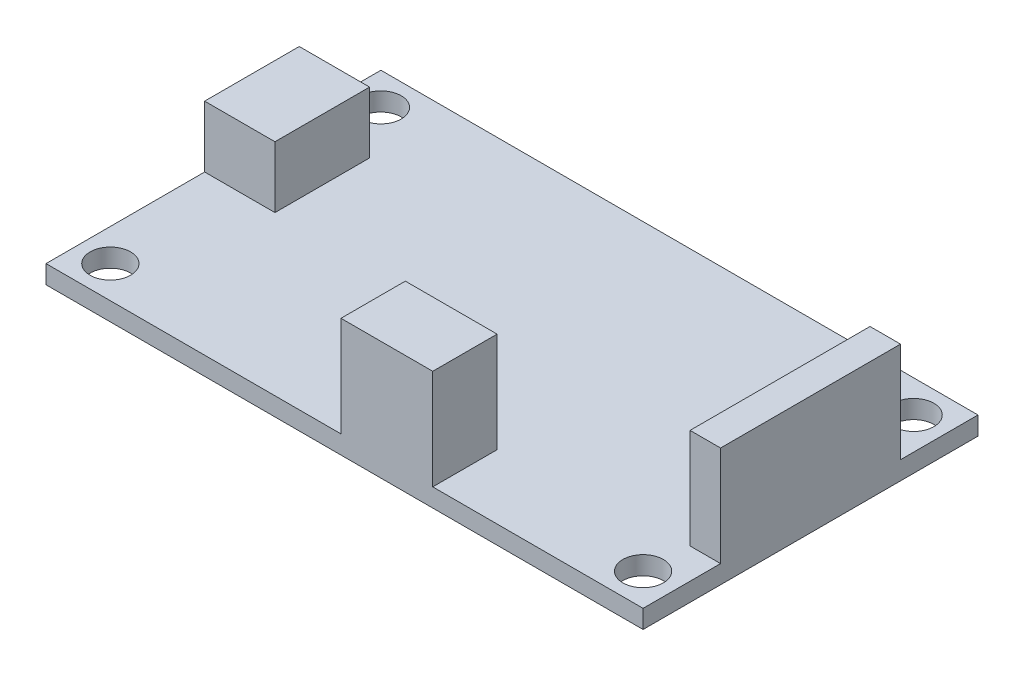
ISO-10303-21;
HEADER;
FILE_DESCRIPTION(('STEP AP214'),'2;1');
FILE_NAME('part.step','',(''),(''),'','','');
FILE_SCHEMA(('AUTOMOTIVE_DESIGN { 1 0 10303 214 1 1 1 1 }'));
ENDSEC;
DATA;
#1=APPLICATION_CONTEXT('core data for automotive mechanical design processes');
#2=APPLICATION_PROTOCOL_DEFINITION('international standard','automotive_design',2000,#1);
#3=PRODUCT_CONTEXT('',#1,'mechanical');
#4=PRODUCT('Part','Part','',(#3));
#5=PRODUCT_RELATED_PRODUCT_CATEGORY('part','',(#4));
#6=PRODUCT_DEFINITION_FORMATION('','',#4);
#7=PRODUCT_DEFINITION_CONTEXT('part definition',#1,'design');
#8=PRODUCT_DEFINITION('design','',#6,#7);
#9=PRODUCT_DEFINITION_SHAPE('','',#8);
#10=(LENGTH_UNIT() NAMED_UNIT(*) SI_UNIT(.MILLI.,.METRE.));
#11=(NAMED_UNIT(*) PLANE_ANGLE_UNIT() SI_UNIT($,.RADIAN.));
#12=(NAMED_UNIT(*) SI_UNIT($,.STERADIAN.) SOLID_ANGLE_UNIT());
#13=UNCERTAINTY_MEASURE_WITH_UNIT(LENGTH_MEASURE(1.E-05),#10,'distance_accuracy_value','');
#14=(GEOMETRIC_REPRESENTATION_CONTEXT(3) GLOBAL_UNCERTAINTY_ASSIGNED_CONTEXT((#13)) GLOBAL_UNIT_ASSIGNED_CONTEXT((#10,
#11,#12)) REPRESENTATION_CONTEXT('',''));
#15=CARTESIAN_POINT('',(0.,0.,0.));
#16=DIRECTION('',(0.,0.,1.));
#17=DIRECTION('',(1.,0.,0.));
#18=AXIS2_PLACEMENT_3D('',#15,#16,#17);
#19=CARTESIAN_POINT('',(-99.1226641897836,1.54,-1.82162319211076));
#20=DIRECTION('',(0.,1.,0.));
#21=DIRECTION('',(0.,0.,1.));
#22=AXIS2_PLACEMENT_3D('',#19,#20,#21);
#23=PLANE('',#22);
#24=CARTESIAN_POINT('',(-51.7226641897835,1.54,-4.52162319211078));
#25=DIRECTION('',(0.,1.,0.));
#26=DIRECTION('',(0.,0.,1.));
#27=AXIS2_PLACEMENT_3D('',#24,#25,#26);
#28=CIRCLE('',#27,1.7);
#29=CARTESIAN_POINT('',(-51.7226641897835,1.54,-2.82162319211078));
#30=VERTEX_POINT('',#29);
#31=EDGE_CURVE('E251',#30,#30,#28,.T.);
#32=ORIENTED_EDGE('',*,*,#31,.F.);
#33=EDGE_LOOP('',(#32));
#34=FACE_BOUND('',#33,.T.);
#35=CARTESIAN_POINT('',(-96.4226641897836,1.54,-27.2216231921108));
#36=DIRECTION('',(0.,1.,0.));
#37=DIRECTION('',(0.,0.,1.));
#38=AXIS2_PLACEMENT_3D('',#35,#36,#37);
#39=CIRCLE('',#38,1.7);
#40=CARTESIAN_POINT('',(-96.4226641897836,1.54,-25.5216231921108));
#41=VERTEX_POINT('',#40);
#42=EDGE_CURVE('E263',#41,#41,#39,.T.);
#43=ORIENTED_EDGE('',*,*,#42,.F.);
#44=EDGE_LOOP('',(#43));
#45=FACE_BOUND('',#44,.T.);
#46=CARTESIAN_POINT('',(-51.7226641897835,1.54,-27.2216231921107));
#47=DIRECTION('',(0.,1.,0.));
#48=DIRECTION('',(0.,0.,-1.));
#49=AXIS2_PLACEMENT_3D('',#46,#47,#48);
#50=CIRCLE('',#49,1.7);
#51=CARTESIAN_POINT('',(-51.7226641897835,1.54,-28.9216231921107));
#52=VERTEX_POINT('',#51);
#53=EDGE_CURVE('E257',#52,#52,#50,.T.);
#54=ORIENTED_EDGE('',*,*,#53,.F.);
#55=EDGE_LOOP('',(#54));
#56=FACE_BOUND('',#55,.T.);
#57=CARTESIAN_POINT('',(-96.4226641897836,1.54,-4.52162319211076));
#58=DIRECTION('',(0.,1.,0.));
#59=DIRECTION('',(0.,0.,-1.));
#60=AXIS2_PLACEMENT_3D('',#57,#58,#59);
#61=CIRCLE('',#60,1.7);
#62=CARTESIAN_POINT('',(-96.4226641897836,1.54,-6.22162319211075));
#63=VERTEX_POINT('',#62);
#64=EDGE_CURVE('E245',#63,#63,#61,.T.);
#65=ORIENTED_EDGE('',*,*,#64,.F.);
#66=EDGE_LOOP('',(#65));
#67=FACE_BOUND('',#66,.T.);
#68=DIRECTION('',(0.,0.,-1.));
#69=VECTOR('',#68,1.);
#70=CARTESIAN_POINT('',(-93.2226641897835,1.54,-23.0716231921108));
#71=LINE('',#70,#69);
#72=CARTESIAN_POINT('',(-93.2226641897835,1.54,-15.1316231921108));
#73=VERTEX_POINT('',#72);
#74=CARTESIAN_POINT('',(-93.2226641897835,1.54,-23.0716231921108));
#75=VERTEX_POINT('',#74);
#76=EDGE_CURVE('E48',#73,#75,#71,.T.);
#77=ORIENTED_EDGE('',*,*,#76,.F.);
#78=DIRECTION('',(1.,0.,0.));
#79=VECTOR('',#78,1.);
#80=CARTESIAN_POINT('',(-99.1226641897835,1.54,-15.1316231921108));
#81=LINE('',#80,#79);
#82=CARTESIAN_POINT('',(-99.1226641897835,1.54,-15.1316231921108));
#83=VERTEX_POINT('',#82);
#84=EDGE_CURVE('E543',#83,#73,#81,.T.);
#85=ORIENTED_EDGE('',*,*,#84,.F.);
#86=DIRECTION('',(0.,0.,1.));
#87=VECTOR('',#86,1.);
#88=CARTESIAN_POINT('',(-99.1226641897835,1.54,-29.9216231921108));
#89=LINE('',#88,#87);
#90=CARTESIAN_POINT('',(-99.1226641897836,1.54,-1.82162319211076));
#91=VERTEX_POINT('',#90);
#92=EDGE_CURVE('E167',#83,#91,#89,.T.);
#93=ORIENTED_EDGE('',*,*,#92,.T.);
#94=DIRECTION('',(1.,0.,0.));
#95=VECTOR('',#94,1.);
#96=CARTESIAN_POINT('',(-99.1226641897836,1.54,-1.82162319211076));
#97=LINE('',#96,#95);
#98=CARTESIAN_POINT('',(-74.3726641897835,1.54,-1.82162319211076));
#99=VERTEX_POINT('',#98);
#100=EDGE_CURVE('E272',#91,#99,#97,.T.);
#101=ORIENTED_EDGE('',*,*,#100,.T.);
#102=DIRECTION('',(0.,0.,1.));
#103=VECTOR('',#102,1.);
#104=CARTESIAN_POINT('',(-74.3726641897835,1.54,-1.82162319211076));
#105=LINE('',#104,#103);
#106=CARTESIAN_POINT('',(-74.3726641897835,1.54,-7.22162319211076));
#107=VERTEX_POINT('',#106);
#108=EDGE_CURVE('E181',#107,#99,#105,.T.);
#109=ORIENTED_EDGE('',*,*,#108,.F.);
#110=DIRECTION('',(-1.,0.,0.));
#111=VECTOR('',#110,1.);
#112=CARTESIAN_POINT('',(-66.6726641897835,1.54,-7.22162319211076));
#113=LINE('',#112,#111);
#114=CARTESIAN_POINT('',(-66.6726641897835,1.54,-7.22162319211076));
#115=VERTEX_POINT('',#114);
#116=EDGE_CURVE('E171',#115,#107,#113,.T.);
#117=ORIENTED_EDGE('',*,*,#116,.F.);
#118=DIRECTION('',(0.,0.,-1.));
#119=VECTOR('',#118,1.);
#120=CARTESIAN_POINT('',(-66.6726641897835,1.54,-1.82162319211076));
#121=LINE('',#120,#119);
#122=CARTESIAN_POINT('',(-66.6726641897835,1.54,-1.82162319211076));
#123=VERTEX_POINT('',#122);
#124=EDGE_CURVE('E168',#123,#115,#121,.T.);
#125=ORIENTED_EDGE('',*,*,#124,.F.);
#126=CARTESIAN_POINT('',(-49.0226641897835,1.54,-1.82162319211076));
#127=VERTEX_POINT('',#126);
#128=EDGE_CURVE('E271',#123,#127,#97,.T.);
#129=ORIENTED_EDGE('',*,*,#128,.T.);
#130=DIRECTION('',(0.,0.,-1.));
#131=VECTOR('',#130,1.);
#132=CARTESIAN_POINT('',(-49.0226641897835,1.54,-29.9216231921108));
#133=LINE('',#132,#131);
#134=CARTESIAN_POINT('',(-49.0226641897835,1.54,-8.32162319211076));
#135=VERTEX_POINT('',#134);
#136=EDGE_CURVE('E283',#127,#135,#133,.T.);
#137=ORIENTED_EDGE('',*,*,#136,.T.);
#138=DIRECTION('',(1.,0.,0.));
#139=VECTOR('',#138,1.);
#140=CARTESIAN_POINT('',(-49.0226641897835,1.54,-8.32162319211076));
#141=LINE('',#140,#139);
#142=CARTESIAN_POINT('',(-51.5826641897835,1.54,-8.32162319211076));
#143=VERTEX_POINT('',#142);
#144=EDGE_CURVE('E208',#143,#135,#141,.T.);
#145=ORIENTED_EDGE('',*,*,#144,.F.);
#146=DIRECTION('',(0.,0.,1.));
#147=VECTOR('',#146,1.);
#148=CARTESIAN_POINT('',(-51.5826641897835,1.54,-23.4216231921108));
#149=LINE('',#148,#147);
#150=CARTESIAN_POINT('',(-51.5826641897835,1.54,-23.4216231921108));
#151=VERTEX_POINT('',#150);
#152=EDGE_CURVE('E215',#151,#143,#149,.T.);
#153=ORIENTED_EDGE('',*,*,#152,.F.);
#154=DIRECTION('',(-1.,0.,0.));
#155=VECTOR('',#154,1.);
#156=CARTESIAN_POINT('',(-49.0226641897835,1.54,-23.4216231921108));
#157=LINE('',#156,#155);
#158=CARTESIAN_POINT('',(-49.0226641897835,1.54,-23.4216231921108));
#159=VERTEX_POINT('',#158);
#160=EDGE_CURVE('E203',#159,#151,#157,.T.);
#161=ORIENTED_EDGE('',*,*,#160,.F.);
#162=CARTESIAN_POINT('',(-49.0226641897835,1.54,-29.9216231921108));
#163=VERTEX_POINT('',#162);
#164=EDGE_CURVE('E274',#159,#163,#133,.T.);
#165=ORIENTED_EDGE('',*,*,#164,.T.);
#166=DIRECTION('',(-1.,0.,0.));
#167=VECTOR('',#166,1.);
#168=CARTESIAN_POINT('',(-99.1226641897835,1.54,-29.9216231921108));
#169=LINE('',#168,#167);
#170=CARTESIAN_POINT('',(-99.1226641897835,1.54,-29.9216231921108));
#171=VERTEX_POINT('',#170);
#172=EDGE_CURVE('E277',#163,#171,#169,.T.);
#173=ORIENTED_EDGE('',*,*,#172,.T.);
#174=CARTESIAN_POINT('',(-99.1226641897835,1.54,-23.0716231921108));
#175=VERTEX_POINT('',#174);
#176=EDGE_CURVE('E269',#171,#175,#89,.T.);
#177=ORIENTED_EDGE('',*,*,#176,.T.);
#178=DIRECTION('',(-1.,0.,0.));
#179=VECTOR('',#178,1.);
#180=CARTESIAN_POINT('',(-99.1226641897835,1.54,-23.0716231921108));
#181=LINE('',#180,#179);
#182=EDGE_CURVE('E53',#75,#175,#181,.T.);
#183=ORIENTED_EDGE('',*,*,#182,.F.);
#184=EDGE_LOOP('',(#77,#85,#93,#101,#109,#117,#125,#129,#137,#145,#153,#161,#165,#173,#177,#183));
#185=FACE_BOUND('',#184,.T.);
#186=ADVANCED_FACE('F31',(#34,#45,#56,#67,#185),#23,.T.);
#187=CARTESIAN_POINT('',(-99.1226641897836,0.,-1.82162319211076));
#188=DIRECTION('',(0.,1.,0.));
#189=DIRECTION('',(0.,0.,1.));
#190=AXIS2_PLACEMENT_3D('',#187,#188,#189);
#191=PLANE('',#190);
#192=CARTESIAN_POINT('',(-51.7226641897835,0.,-4.52162319211078));
#193=DIRECTION('',(0.,1.,0.));
#194=DIRECTION('',(0.,0.,1.));
#195=AXIS2_PLACEMENT_3D('',#192,#193,#194);
#196=CIRCLE('',#195,1.7);
#197=CARTESIAN_POINT('',(-51.7226641897835,0.,-2.82162319211078));
#198=VERTEX_POINT('',#197);
#199=EDGE_CURVE('E248',#198,#198,#196,.T.);
#200=ORIENTED_EDGE('',*,*,#199,.T.);
#201=EDGE_LOOP('',(#200));
#202=FACE_BOUND('',#201,.T.);
#203=CARTESIAN_POINT('',(-96.4226641897836,0.,-27.2216231921108));
#204=DIRECTION('',(0.,1.,0.));
#205=DIRECTION('',(0.,0.,1.));
#206=AXIS2_PLACEMENT_3D('',#203,#204,#205);
#207=CIRCLE('',#206,1.7);
#208=CARTESIAN_POINT('',(-96.4226641897836,0.,-25.5216231921108));
#209=VERTEX_POINT('',#208);
#210=EDGE_CURVE('E260',#209,#209,#207,.T.);
#211=ORIENTED_EDGE('',*,*,#210,.T.);
#212=EDGE_LOOP('',(#211));
#213=FACE_BOUND('',#212,.T.);
#214=DIRECTION('',(0.,0.,1.));
#215=VECTOR('',#214,1.);
#216=CARTESIAN_POINT('',(-99.1226641897835,0.,-29.9216231921108));
#217=LINE('',#216,#215);
#218=CARTESIAN_POINT('',(-99.1226641897835,0.,-29.9216231921108));
#219=VERTEX_POINT('',#218);
#220=CARTESIAN_POINT('',(-99.1226641897836,0.,-1.82162319211076));
#221=VERTEX_POINT('',#220);
#222=EDGE_CURVE('E266',#219,#221,#217,.T.);
#223=ORIENTED_EDGE('',*,*,#222,.F.);
#224=DIRECTION('',(-1.,0.,0.));
#225=VECTOR('',#224,1.);
#226=CARTESIAN_POINT('',(-99.1226641897835,0.,-29.9216231921108));
#227=LINE('',#226,#225);
#228=CARTESIAN_POINT('',(-49.0226641897835,0.,-29.9216231921108));
#229=VERTEX_POINT('',#228);
#230=EDGE_CURVE('E293',#229,#219,#227,.T.);
#231=ORIENTED_EDGE('',*,*,#230,.F.);
#232=DIRECTION('',(0.,0.,-1.));
#233=VECTOR('',#232,1.);
#234=CARTESIAN_POINT('',(-49.0226641897835,0.,-29.9216231921108));
#235=LINE('',#234,#233);
#236=CARTESIAN_POINT('',(-49.0226641897835,0.,-1.82162319211076));
#237=VERTEX_POINT('',#236);
#238=EDGE_CURVE('E295',#237,#229,#235,.T.);
#239=ORIENTED_EDGE('',*,*,#238,.F.);
#240=DIRECTION('',(1.,0.,0.));
#241=VECTOR('',#240,1.);
#242=CARTESIAN_POINT('',(-99.1226641897836,0.,-1.82162319211076));
#243=LINE('',#242,#241);
#244=EDGE_CURVE('E297',#221,#237,#243,.T.);
#245=ORIENTED_EDGE('',*,*,#244,.F.);
#246=EDGE_LOOP('',(#223,#231,#239,#245));
#247=FACE_BOUND('',#246,.T.);
#248=CARTESIAN_POINT('',(-51.7226641897835,0.,-27.2216231921107));
#249=DIRECTION('',(0.,1.,0.));
#250=DIRECTION('',(0.,0.,-1.));
#251=AXIS2_PLACEMENT_3D('',#248,#249,#250);
#252=CIRCLE('',#251,1.7);
#253=CARTESIAN_POINT('',(-51.7226641897835,0.,-28.9216231921107));
#254=VERTEX_POINT('',#253);
#255=EDGE_CURVE('E254',#254,#254,#252,.T.);
#256=ORIENTED_EDGE('',*,*,#255,.T.);
#257=EDGE_LOOP('',(#256));
#258=FACE_BOUND('',#257,.T.);
#259=CARTESIAN_POINT('',(-96.4226641897836,0.,-4.52162319211076));
#260=DIRECTION('',(0.,1.,0.));
#261=DIRECTION('',(0.,0.,-1.));
#262=AXIS2_PLACEMENT_3D('',#259,#260,#261);
#263=CIRCLE('',#262,1.7);
#264=CARTESIAN_POINT('',(-96.4226641897836,0.,-6.22162319211075));
#265=VERTEX_POINT('',#264);
#266=EDGE_CURVE('E243',#265,#265,#263,.T.);
#267=ORIENTED_EDGE('',*,*,#266,.T.);
#268=EDGE_LOOP('',(#267));
#269=FACE_BOUND('',#268,.T.);
#270=ADVANCED_FACE('F303',(#202,#213,#247,#258,#269),#191,.F.);
#271=CARTESIAN_POINT('',(-99.1226641897835,1.54,-29.9216231921108));
#272=DIRECTION('',(1.,0.,0.));
#273=DIRECTION('',(0.,0.,-1.));
#274=AXIS2_PLACEMENT_3D('',#271,#272,#273);
#275=PLANE('',#274);
#276=ORIENTED_EDGE('',*,*,#222,.T.);
#277=DIRECTION('',(0.,-1.,0.));
#278=VECTOR('',#277,1.);
#279=CARTESIAN_POINT('',(-99.1226641897836,1.54,-1.82162319211076));
#280=LINE('',#279,#278);
#281=EDGE_CURVE('E11',#91,#221,#280,.T.);
#282=ORIENTED_EDGE('',*,*,#281,.F.);
#283=ORIENTED_EDGE('',*,*,#92,.F.);
#284=DIRECTION('',(0.,-1.,0.));
#285=VECTOR('',#284,1.);
#286=CARTESIAN_POINT('',(-99.1226641897835,6.69,-15.1316231921108));
#287=LINE('',#286,#285);
#288=CARTESIAN_POINT('',(-99.1226641897835,6.69,-15.1316231921108));
#289=VERTEX_POINT('',#288);
#290=EDGE_CURVE('E149',#289,#83,#287,.T.);
#291=ORIENTED_EDGE('',*,*,#290,.F.);
#292=DIRECTION('',(0.,0.,1.));
#293=VECTOR('',#292,1.);
#294=CARTESIAN_POINT('',(-99.1226641897835,6.69,-23.0716231921108));
#295=LINE('',#294,#293);
#296=CARTESIAN_POINT('',(-99.1226641897835,6.69,-23.0716231921108));
#297=VERTEX_POINT('',#296);
#298=EDGE_CURVE('E155',#297,#289,#295,.T.);
#299=ORIENTED_EDGE('',*,*,#298,.F.);
#300=DIRECTION('',(0.,-1.,0.));
#301=VECTOR('',#300,1.);
#302=CARTESIAN_POINT('',(-99.1226641897835,6.69,-23.0716231921108));
#303=LINE('',#302,#301);
#304=EDGE_CURVE('E536',#297,#175,#303,.T.);
#305=ORIENTED_EDGE('',*,*,#304,.T.);
#306=ORIENTED_EDGE('',*,*,#176,.F.);
#307=DIRECTION('',(0.,-1.,0.));
#308=VECTOR('',#307,1.);
#309=CARTESIAN_POINT('',(-99.1226641897835,1.54,-29.9216231921108));
#310=LINE('',#309,#308);
#311=EDGE_CURVE('E290',#171,#219,#310,.T.);
#312=ORIENTED_EDGE('',*,*,#311,.T.);
#313=EDGE_LOOP('',(#276,#282,#283,#291,#299,#305,#306,#312));
#314=FACE_BOUND('',#313,.T.);
#315=ADVANCED_FACE('F33',(#314),#275,.F.);
#316=CARTESIAN_POINT('',(-99.1226641897836,1.54,-1.82162319211076));
#317=DIRECTION('',(0.,0.,-1.));
#318=DIRECTION('',(-1.,0.,0.));
#319=AXIS2_PLACEMENT_3D('',#316,#317,#318);
#320=PLANE('',#319);
#321=ORIENTED_EDGE('',*,*,#244,.T.);
#322=DIRECTION('',(0.,-1.,0.));
#323=VECTOR('',#322,1.);
#324=CARTESIAN_POINT('',(-49.0226641897835,1.54,-1.82162319211076));
#325=LINE('',#324,#323);
#326=EDGE_CURVE('E40',#127,#237,#325,.T.);
#327=ORIENTED_EDGE('',*,*,#326,.F.);
#328=ORIENTED_EDGE('',*,*,#128,.F.);
#329=DIRECTION('',(0.,-1.,0.));
#330=VECTOR('',#329,1.);
#331=CARTESIAN_POINT('',(-66.6726641897835,9.94,-1.82162319211076));
#332=LINE('',#331,#330);
#333=CARTESIAN_POINT('',(-66.6726641897835,9.94,-1.82162319211076));
#334=VERTEX_POINT('',#333);
#335=EDGE_CURVE('E186',#334,#123,#332,.T.);
#336=ORIENTED_EDGE('',*,*,#335,.F.);
#337=DIRECTION('',(1.,0.,0.));
#338=VECTOR('',#337,1.);
#339=CARTESIAN_POINT('',(-66.6726641897835,9.94,-1.82162319211076));
#340=LINE('',#339,#338);
#341=CARTESIAN_POINT('',(-74.3726641897835,9.94,-1.82162319211076));
#342=VERTEX_POINT('',#341);
#343=EDGE_CURVE('E185',#342,#334,#340,.T.);
#344=ORIENTED_EDGE('',*,*,#343,.F.);
#345=DIRECTION('',(0.,-1.,0.));
#346=VECTOR('',#345,1.);
#347=CARTESIAN_POINT('',(-74.3726641897835,9.94,-1.82162319211076));
#348=LINE('',#347,#346);
#349=EDGE_CURVE('E194',#342,#99,#348,.T.);
#350=ORIENTED_EDGE('',*,*,#349,.T.);
#351=ORIENTED_EDGE('',*,*,#100,.F.);
#352=ORIENTED_EDGE('',*,*,#281,.T.);
#353=EDGE_LOOP('',(#321,#327,#328,#336,#344,#350,#351,#352));
#354=FACE_BOUND('',#353,.T.);
#355=ADVANCED_FACE('F309',(#354),#320,.F.);
#356=CARTESIAN_POINT('',(-49.0226641897835,1.54,-29.9216231921108));
#357=DIRECTION('',(-1.,0.,0.));
#358=DIRECTION('',(0.,0.,1.));
#359=AXIS2_PLACEMENT_3D('',#356,#357,#358);
#360=PLANE('',#359);
#361=ORIENTED_EDGE('',*,*,#238,.T.);
#362=DIRECTION('',(0.,-1.,0.));
#363=VECTOR('',#362,1.);
#364=CARTESIAN_POINT('',(-49.0226641897835,1.54,-29.9216231921108));
#365=LINE('',#364,#363);
#366=EDGE_CURVE('E287',#163,#229,#365,.T.);
#367=ORIENTED_EDGE('',*,*,#366,.F.);
#368=ORIENTED_EDGE('',*,*,#164,.F.);
#369=DIRECTION('',(0.,-1.,0.));
#370=VECTOR('',#369,1.);
#371=CARTESIAN_POINT('',(-49.0226641897835,9.94,-23.4216231921108));
#372=LINE('',#371,#370);
#373=CARTESIAN_POINT('',(-49.0226641897835,9.94,-23.4216231921108));
#374=VERTEX_POINT('',#373);
#375=EDGE_CURVE('E238',#374,#159,#372,.T.);
#376=ORIENTED_EDGE('',*,*,#375,.F.);
#377=DIRECTION('',(0.,0.,-1.));
#378=VECTOR('',#377,1.);
#379=CARTESIAN_POINT('',(-49.0226641897835,9.94,-23.4216231921108));
#380=LINE('',#379,#378);
#381=CARTESIAN_POINT('',(-49.0226641897835,9.94,-8.32162319211076));
#382=VERTEX_POINT('',#381);
#383=EDGE_CURVE('E204',#382,#374,#380,.T.);
#384=ORIENTED_EDGE('',*,*,#383,.F.);
#385=DIRECTION('',(0.,-1.,0.));
#386=VECTOR('',#385,1.);
#387=CARTESIAN_POINT('',(-49.0226641897835,9.94,-8.32162319211076));
#388=LINE('',#387,#386);
#389=EDGE_CURVE('E214',#382,#135,#388,.T.);
#390=ORIENTED_EDGE('',*,*,#389,.T.);
#391=ORIENTED_EDGE('',*,*,#136,.F.);
#392=ORIENTED_EDGE('',*,*,#326,.T.);
#393=EDGE_LOOP('',(#361,#367,#368,#376,#384,#390,#391,#392));
#394=FACE_BOUND('',#393,.T.);
#395=ADVANCED_FACE('F324',(#394),#360,.F.);
#396=CARTESIAN_POINT('',(-99.1226641897835,1.54,-29.9216231921108));
#397=DIRECTION('',(0.,0.,1.));
#398=DIRECTION('',(1.,0.,0.));
#399=AXIS2_PLACEMENT_3D('',#396,#397,#398);
#400=PLANE('',#399);
#401=ORIENTED_EDGE('',*,*,#230,.T.);
#402=ORIENTED_EDGE('',*,*,#311,.F.);
#403=ORIENTED_EDGE('',*,*,#172,.F.);
#404=ORIENTED_EDGE('',*,*,#366,.T.);
#405=EDGE_LOOP('',(#401,#402,#403,#404));
#406=FACE_BOUND('',#405,.T.);
#407=ADVANCED_FACE('F361',(#406),#400,.F.);
#408=CARTESIAN_POINT('',(-96.4226641897836,1.54,-27.2216231921108));
#409=DIRECTION('',(0.,-1.,0.));
#410=DIRECTION('',(0.,0.,-1.));
#411=AXIS2_PLACEMENT_3D('',#408,#409,#410);
#412=CYLINDRICAL_SURFACE('',#411,1.7);
#413=ORIENTED_EDGE('',*,*,#42,.T.);
#414=EDGE_LOOP('',(#413));
#415=FACE_BOUND('',#414,.T.);
#416=ORIENTED_EDGE('',*,*,#210,.F.);
#417=EDGE_LOOP('',(#416));
#418=FACE_BOUND('',#417,.T.);
#419=ADVANCED_FACE('F358',(#415,#418),#412,.F.);
#420=CARTESIAN_POINT('',(-51.7226641897835,1.54,-27.2216231921107));
#421=DIRECTION('',(0.,-1.,0.));
#422=DIRECTION('',(0.,0.,-1.));
#423=AXIS2_PLACEMENT_3D('',#420,#421,#422);
#424=CYLINDRICAL_SURFACE('',#423,1.7);
#425=ORIENTED_EDGE('',*,*,#53,.T.);
#426=EDGE_LOOP('',(#425));
#427=FACE_BOUND('',#426,.T.);
#428=ORIENTED_EDGE('',*,*,#255,.F.);
#429=EDGE_LOOP('',(#428));
#430=FACE_BOUND('',#429,.T.);
#431=ADVANCED_FACE('F394',(#427,#430),#424,.F.);
#432=CARTESIAN_POINT('',(-51.7226641897835,1.54,-4.52162319211078));
#433=DIRECTION('',(0.,-1.,0.));
#434=DIRECTION('',(0.,0.,-1.));
#435=AXIS2_PLACEMENT_3D('',#432,#433,#434);
#436=CYLINDRICAL_SURFACE('',#435,1.7);
#437=ORIENTED_EDGE('',*,*,#31,.T.);
#438=EDGE_LOOP('',(#437));
#439=FACE_BOUND('',#438,.T.);
#440=ORIENTED_EDGE('',*,*,#199,.F.);
#441=EDGE_LOOP('',(#440));
#442=FACE_BOUND('',#441,.T.);
#443=ADVANCED_FACE('F344',(#439,#442),#436,.F.);
#444=CARTESIAN_POINT('',(-96.4226641897836,1.54,-4.52162319211076));
#445=DIRECTION('',(0.,-1.,0.));
#446=DIRECTION('',(0.,0.,-1.));
#447=AXIS2_PLACEMENT_3D('',#444,#445,#446);
#448=CYLINDRICAL_SURFACE('',#447,1.7);
#449=ORIENTED_EDGE('',*,*,#64,.T.);
#450=EDGE_LOOP('',(#449));
#451=FACE_BOUND('',#450,.T.);
#452=ORIENTED_EDGE('',*,*,#266,.F.);
#453=EDGE_LOOP('',(#452));
#454=FACE_BOUND('',#453,.T.);
#455=ADVANCED_FACE('F337',(#451,#454),#448,.F.);
#456=CARTESIAN_POINT('',(-49.0226641897835,9.94,-23.4216231921108));
#457=DIRECTION('',(0.,0.,1.));
#458=DIRECTION('',(1.,0.,0.));
#459=AXIS2_PLACEMENT_3D('',#456,#457,#458);
#460=PLANE('',#459);
#461=ORIENTED_EDGE('',*,*,#160,.T.);
#462=DIRECTION('',(0.,-1.,0.));
#463=VECTOR('',#462,1.);
#464=CARTESIAN_POINT('',(-51.5826641897835,9.94,-23.4216231921108));
#465=LINE('',#464,#463);
#466=CARTESIAN_POINT('',(-51.5826641897835,9.94,-23.4216231921108));
#467=VERTEX_POINT('',#466);
#468=EDGE_CURVE('E233',#467,#151,#465,.T.);
#469=ORIENTED_EDGE('',*,*,#468,.F.);
#470=DIRECTION('',(-1.,0.,0.));
#471=VECTOR('',#470,1.);
#472=CARTESIAN_POINT('',(-49.0226641897835,9.94,-23.4216231921108));
#473=LINE('',#472,#471);
#474=EDGE_CURVE('E207',#374,#467,#473,.T.);
#475=ORIENTED_EDGE('',*,*,#474,.F.);
#476=ORIENTED_EDGE('',*,*,#375,.T.);
#477=EDGE_LOOP('',(#461,#469,#475,#476));
#478=FACE_BOUND('',#477,.T.);
#479=ADVANCED_FACE('F333',(#478),#460,.F.);
#480=CARTESIAN_POINT('',(-51.5826641897835,9.94,-23.4216231921108));
#481=DIRECTION('',(1.,0.,0.));
#482=DIRECTION('',(0.,0.,-1.));
#483=AXIS2_PLACEMENT_3D('',#480,#481,#482);
#484=PLANE('',#483);
#485=ORIENTED_EDGE('',*,*,#152,.T.);
#486=DIRECTION('',(0.,-1.,0.));
#487=VECTOR('',#486,1.);
#488=CARTESIAN_POINT('',(-51.5826641897835,9.94,-8.32162319211076));
#489=LINE('',#488,#487);
#490=CARTESIAN_POINT('',(-51.5826641897835,9.94,-8.32162319211076));
#491=VERTEX_POINT('',#490);
#492=EDGE_CURVE('E220',#491,#143,#489,.T.);
#493=ORIENTED_EDGE('',*,*,#492,.F.);
#494=DIRECTION('',(0.,0.,1.));
#495=VECTOR('',#494,1.);
#496=CARTESIAN_POINT('',(-51.5826641897835,9.94,-23.4216231921108));
#497=LINE('',#496,#495);
#498=EDGE_CURVE('E210',#467,#491,#497,.T.);
#499=ORIENTED_EDGE('',*,*,#498,.F.);
#500=ORIENTED_EDGE('',*,*,#468,.T.);
#501=EDGE_LOOP('',(#485,#493,#499,#500));
#502=FACE_BOUND('',#501,.T.);
#503=ADVANCED_FACE('F330',(#502),#484,.F.);
#504=CARTESIAN_POINT('',(-49.0226641897835,9.94,-8.32162319211076));
#505=DIRECTION('',(0.,0.,-1.));
#506=DIRECTION('',(-1.,0.,0.));
#507=AXIS2_PLACEMENT_3D('',#504,#505,#506);
#508=PLANE('',#507);
#509=ORIENTED_EDGE('',*,*,#144,.T.);
#510=ORIENTED_EDGE('',*,*,#389,.F.);
#511=DIRECTION('',(1.,0.,0.));
#512=VECTOR('',#511,1.);
#513=CARTESIAN_POINT('',(-49.0226641897835,9.94,-8.32162319211076));
#514=LINE('',#513,#512);
#515=EDGE_CURVE('E212',#491,#382,#514,.T.);
#516=ORIENTED_EDGE('',*,*,#515,.F.);
#517=ORIENTED_EDGE('',*,*,#492,.T.);
#518=EDGE_LOOP('',(#509,#510,#516,#517));
#519=FACE_BOUND('',#518,.T.);
#520=ADVANCED_FACE('F325',(#519),#508,.F.);
#521=CARTESIAN_POINT('',(-49.0226641897835,9.94,-8.32162319211076));
#522=DIRECTION('',(0.,-1.,0.));
#523=DIRECTION('',(0.,0.,-1.));
#524=AXIS2_PLACEMENT_3D('',#521,#522,#523);
#525=PLANE('',#524);
#526=ORIENTED_EDGE('',*,*,#383,.T.);
#527=ORIENTED_EDGE('',*,*,#474,.T.);
#528=ORIENTED_EDGE('',*,*,#498,.T.);
#529=ORIENTED_EDGE('',*,*,#515,.T.);
#530=EDGE_LOOP('',(#526,#527,#528,#529));
#531=FACE_BOUND('',#530,.T.);
#532=ADVANCED_FACE('F329',(#531),#525,.F.);
#533=CARTESIAN_POINT('',(-66.6726641897835,9.94,-1.82162319211076));
#534=DIRECTION('',(-1.,0.,0.));
#535=DIRECTION('',(0.,0.,1.));
#536=AXIS2_PLACEMENT_3D('',#533,#534,#535);
#537=PLANE('',#536);
#538=ORIENTED_EDGE('',*,*,#124,.T.);
#539=DIRECTION('',(0.,-1.,0.));
#540=VECTOR('',#539,1.);
#541=CARTESIAN_POINT('',(-66.6726641897835,9.94,-7.22162319211076));
#542=LINE('',#541,#540);
#543=CARTESIAN_POINT('',(-66.6726641897835,9.94,-7.22162319211076));
#544=VERTEX_POINT('',#543);
#545=EDGE_CURVE('E200',#544,#115,#542,.T.);
#546=ORIENTED_EDGE('',*,*,#545,.F.);
#547=DIRECTION('',(0.,0.,-1.));
#548=VECTOR('',#547,1.);
#549=CARTESIAN_POINT('',(-66.6726641897835,9.94,-1.82162319211076));
#550=LINE('',#549,#548);
#551=EDGE_CURVE('E177',#334,#544,#550,.T.);
#552=ORIENTED_EDGE('',*,*,#551,.F.);
#553=ORIENTED_EDGE('',*,*,#335,.T.);
#554=EDGE_LOOP('',(#538,#546,#552,#553));
#555=FACE_BOUND('',#554,.T.);
#556=ADVANCED_FACE('F323',(#555),#537,.F.);
#557=CARTESIAN_POINT('',(-66.6726641897835,9.94,-7.22162319211076));
#558=DIRECTION('',(0.,0.,1.));
#559=DIRECTION('',(1.,0.,0.));
#560=AXIS2_PLACEMENT_3D('',#557,#558,#559);
#561=PLANE('',#560);
#562=ORIENTED_EDGE('',*,*,#116,.T.);
#563=DIRECTION('',(0.,-1.,0.));
#564=VECTOR('',#563,1.);
#565=CARTESIAN_POINT('',(-74.3726641897835,9.94,-7.22162319211076));
#566=LINE('',#565,#564);
#567=CARTESIAN_POINT('',(-74.3726641897835,9.94,-7.22162319211076));
#568=VERTEX_POINT('',#567);
#569=EDGE_CURVE('E197',#568,#107,#566,.T.);
#570=ORIENTED_EDGE('',*,*,#569,.F.);
#571=DIRECTION('',(-1.,0.,0.));
#572=VECTOR('',#571,1.);
#573=CARTESIAN_POINT('',(-66.6726641897835,9.94,-7.22162319211076));
#574=LINE('',#573,#572);
#575=EDGE_CURVE('E180',#544,#568,#574,.T.);
#576=ORIENTED_EDGE('',*,*,#575,.F.);
#577=ORIENTED_EDGE('',*,*,#545,.T.);
#578=EDGE_LOOP('',(#562,#570,#576,#577));
#579=FACE_BOUND('',#578,.T.);
#580=ADVANCED_FACE('F317',(#579),#561,.F.);
#581=CARTESIAN_POINT('',(-74.3726641897835,9.94,-1.82162319211076));
#582=DIRECTION('',(1.,0.,0.));
#583=DIRECTION('',(0.,0.,-1.));
#584=AXIS2_PLACEMENT_3D('',#581,#582,#583);
#585=PLANE('',#584);
#586=ORIENTED_EDGE('',*,*,#108,.T.);
#587=ORIENTED_EDGE('',*,*,#349,.F.);
#588=DIRECTION('',(0.,0.,1.));
#589=VECTOR('',#588,1.);
#590=CARTESIAN_POINT('',(-74.3726641897835,9.94,-1.82162319211076));
#591=LINE('',#590,#589);
#592=EDGE_CURVE('E183',#568,#342,#591,.T.);
#593=ORIENTED_EDGE('',*,*,#592,.F.);
#594=ORIENTED_EDGE('',*,*,#569,.T.);
#595=EDGE_LOOP('',(#586,#587,#593,#594));
#596=FACE_BOUND('',#595,.T.);
#597=ADVANCED_FACE('F313',(#596),#585,.F.);
#598=CARTESIAN_POINT('',(-66.6726641897835,9.94,-7.22162319211076));
#599=DIRECTION('',(0.,1.,0.));
#600=DIRECTION('',(0.,0.,1.));
#601=AXIS2_PLACEMENT_3D('',#598,#599,#600);
#602=PLANE('',#601);
#603=ORIENTED_EDGE('',*,*,#551,.T.);
#604=ORIENTED_EDGE('',*,*,#575,.T.);
#605=ORIENTED_EDGE('',*,*,#592,.T.);
#606=ORIENTED_EDGE('',*,*,#343,.T.);
#607=EDGE_LOOP('',(#603,#604,#605,#606));
#608=FACE_BOUND('',#607,.T.);
#609=ADVANCED_FACE('F479',(#608),#602,.T.);
#610=CARTESIAN_POINT('',(-99.1226641897835,6.69,-15.1316231921108));
#611=DIRECTION('',(0.,0.,-1.));
#612=DIRECTION('',(-1.,0.,0.));
#613=AXIS2_PLACEMENT_3D('',#610,#611,#612);
#614=PLANE('',#613);
#615=ORIENTED_EDGE('',*,*,#84,.T.);
#616=DIRECTION('',(0.,-1.,0.));
#617=VECTOR('',#616,1.);
#618=CARTESIAN_POINT('',(-93.2226641897835,6.69,-15.1316231921108));
#619=LINE('',#618,#617);
#620=CARTESIAN_POINT('',(-93.2226641897835,6.69,-15.1316231921108));
#621=VERTEX_POINT('',#620);
#622=EDGE_CURVE('E151',#621,#73,#619,.T.);
#623=ORIENTED_EDGE('',*,*,#622,.F.);
#624=DIRECTION('',(1.,0.,0.));
#625=VECTOR('',#624,1.);
#626=CARTESIAN_POINT('',(-99.1226641897835,6.69,-15.1316231921108));
#627=LINE('',#626,#625);
#628=EDGE_CURVE('E145',#289,#621,#627,.T.);
#629=ORIENTED_EDGE('',*,*,#628,.F.);
#630=ORIENTED_EDGE('',*,*,#290,.T.);
#631=EDGE_LOOP('',(#615,#623,#629,#630));
#632=FACE_BOUND('',#631,.T.);
#633=ADVANCED_FACE('F147',(#632),#614,.F.);
#634=CARTESIAN_POINT('',(-93.2226641897835,6.69,-23.0716231921108));
#635=DIRECTION('',(-1.,0.,0.));
#636=DIRECTION('',(0.,0.,1.));
#637=AXIS2_PLACEMENT_3D('',#634,#635,#636);
#638=PLANE('',#637);
#639=ORIENTED_EDGE('',*,*,#76,.T.);
#640=DIRECTION('',(0.,-1.,0.));
#641=VECTOR('',#640,1.);
#642=CARTESIAN_POINT('',(-93.2226641897835,6.69,-23.0716231921108));
#643=LINE('',#642,#641);
#644=CARTESIAN_POINT('',(-93.2226641897835,6.69,-23.0716231921108));
#645=VERTEX_POINT('',#644);
#646=EDGE_CURVE('E173',#645,#75,#643,.T.);
#647=ORIENTED_EDGE('',*,*,#646,.F.);
#648=DIRECTION('',(0.,0.,-1.));
#649=VECTOR('',#648,1.);
#650=CARTESIAN_POINT('',(-93.2226641897835,6.69,-23.0716231921108));
#651=LINE('',#650,#649);
#652=EDGE_CURVE('E154',#621,#645,#651,.T.);
#653=ORIENTED_EDGE('',*,*,#652,.F.);
#654=ORIENTED_EDGE('',*,*,#622,.T.);
#655=EDGE_LOOP('',(#639,#647,#653,#654));
#656=FACE_BOUND('',#655,.T.);
#657=ADVANCED_FACE('F505',(#656),#638,.F.);
#658=CARTESIAN_POINT('',(-99.1226641897835,6.69,-23.0716231921108));
#659=DIRECTION('',(0.,0.,1.));
#660=DIRECTION('',(1.,0.,0.));
#661=AXIS2_PLACEMENT_3D('',#658,#659,#660);
#662=PLANE('',#661);
#663=ORIENTED_EDGE('',*,*,#182,.T.);
#664=ORIENTED_EDGE('',*,*,#304,.F.);
#665=DIRECTION('',(-1.,0.,0.));
#666=VECTOR('',#665,1.);
#667=CARTESIAN_POINT('',(-99.1226641897835,6.69,-23.0716231921108));
#668=LINE('',#667,#666);
#669=EDGE_CURVE('E160',#645,#297,#668,.T.);
#670=ORIENTED_EDGE('',*,*,#669,.F.);
#671=ORIENTED_EDGE('',*,*,#646,.T.);
#672=EDGE_LOOP('',(#663,#664,#670,#671));
#673=FACE_BOUND('',#672,.T.);
#674=ADVANCED_FACE('F513',(#673),#662,.F.);
#675=CARTESIAN_POINT('',(-99.1226641897835,6.69,-15.1316231921108));
#676=DIRECTION('',(0.,1.,0.));
#677=DIRECTION('',(0.,0.,1.));
#678=AXIS2_PLACEMENT_3D('',#675,#676,#677);
#679=PLANE('',#678);
#680=ORIENTED_EDGE('',*,*,#298,.T.);
#681=ORIENTED_EDGE('',*,*,#628,.T.);
#682=ORIENTED_EDGE('',*,*,#652,.T.);
#683=ORIENTED_EDGE('',*,*,#669,.T.);
#684=EDGE_LOOP('',(#680,#681,#682,#683));
#685=FACE_BOUND('',#684,.T.);
#686=ADVANCED_FACE('F158',(#685),#679,.T.);
#687=CLOSED_SHELL('',(#186,#270,#315,#355,#395,#407,#419,#431,#443,#455,#479,#503,#520,#532,
#556,#580,#597,#609,#633,#657,#674,#686));
#688=MANIFOLD_SOLID_BREP('B2',#687);
#689=ADVANCED_BREP_SHAPE_REPRESENTATION('',(#18,#688),#14);
#690=SHAPE_DEFINITION_REPRESENTATION(#9,#689);
ENDSEC;
END-ISO-10303-21;
